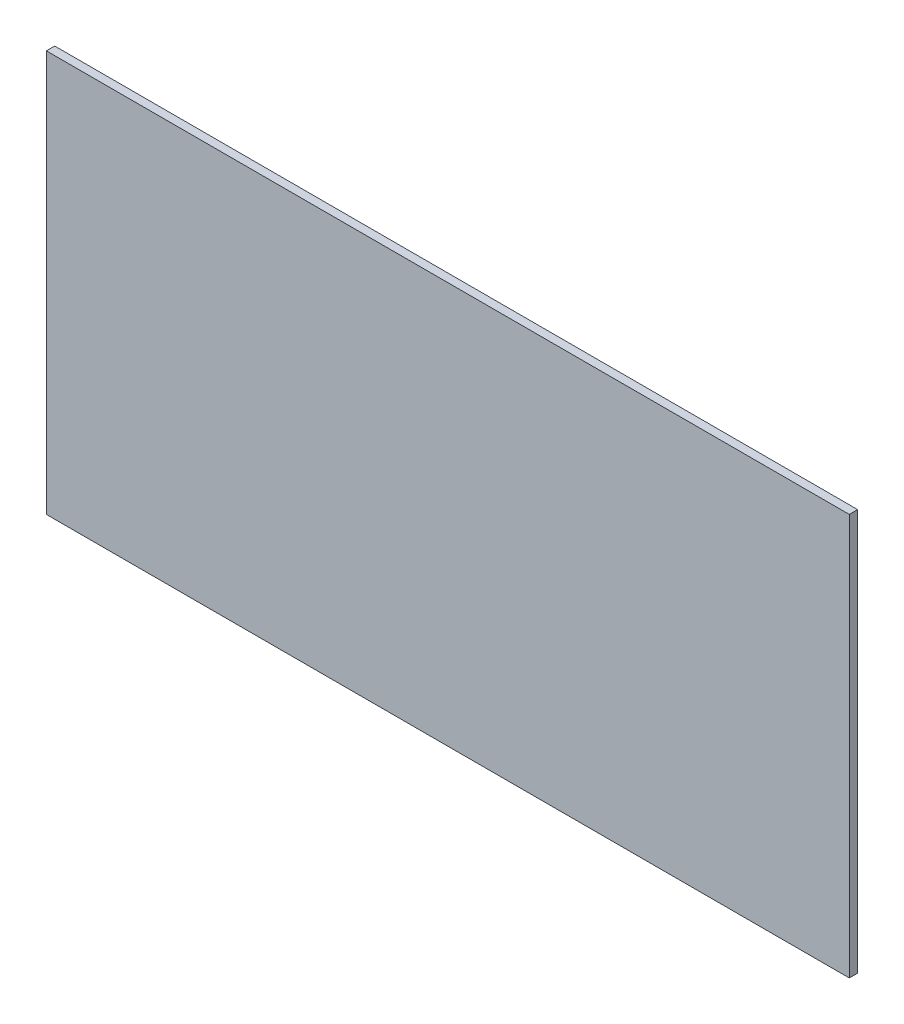
ISO-10303-21;
HEADER;
FILE_DESCRIPTION(('STEP AP214'),'2;1');
FILE_NAME('part.step','',(''),(''),'','','');
FILE_SCHEMA(('AUTOMOTIVE_DESIGN { 1 0 10303 214 1 1 1 1 }'));
ENDSEC;
DATA;
#1=APPLICATION_CONTEXT('core data for automotive mechanical design processes');
#2=APPLICATION_PROTOCOL_DEFINITION('international standard','automotive_design',2000,#1);
#3=PRODUCT_CONTEXT('',#1,'mechanical');
#4=PRODUCT('Part','Part','',(#3));
#5=PRODUCT_RELATED_PRODUCT_CATEGORY('part','',(#4));
#6=PRODUCT_DEFINITION_FORMATION('','',#4);
#7=PRODUCT_DEFINITION_CONTEXT('part definition',#1,'design');
#8=PRODUCT_DEFINITION('design','',#6,#7);
#9=PRODUCT_DEFINITION_SHAPE('','',#8);
#10=(LENGTH_UNIT() NAMED_UNIT(*) SI_UNIT(.MILLI.,.METRE.));
#11=(NAMED_UNIT(*) PLANE_ANGLE_UNIT() SI_UNIT($,.RADIAN.));
#12=(NAMED_UNIT(*) SI_UNIT($,.STERADIAN.) SOLID_ANGLE_UNIT());
#13=UNCERTAINTY_MEASURE_WITH_UNIT(LENGTH_MEASURE(1.E-05),#10,'distance_accuracy_value','');
#14=(GEOMETRIC_REPRESENTATION_CONTEXT(3) GLOBAL_UNCERTAINTY_ASSIGNED_CONTEXT((#13)) GLOBAL_UNIT_ASSIGNED_CONTEXT((#10,
#11,#12)) REPRESENTATION_CONTEXT('',''));
#15=CARTESIAN_POINT('',(0.,0.,0.));
#16=DIRECTION('',(0.,0.,1.));
#17=DIRECTION('',(1.,0.,0.));
#18=AXIS2_PLACEMENT_3D('',#15,#16,#17);
#19=CARTESIAN_POINT('',(0.,0.,19.05));
#20=DIRECTION('',(1.,0.,0.));
#21=DIRECTION('',(0.,1.,0.));
#22=AXIS2_PLACEMENT_3D('',#19,#20,#21);
#23=PLANE('',#22);
#24=DIRECTION('',(0.,-1.,0.));
#25=VECTOR('',#24,1.);
#26=CARTESIAN_POINT('',(0.,0.,0.));
#27=LINE('',#26,#25);
#28=CARTESIAN_POINT('',(0.,0.,0.));
#29=VERTEX_POINT('',#28);
#30=CARTESIAN_POINT('',(1.11981703314034E-13,-914.4,0.));
#31=VERTEX_POINT('',#30);
#32=EDGE_CURVE('E96',#29,#31,#27,.T.);
#33=ORIENTED_EDGE('',*,*,#32,.T.);
#34=DIRECTION('',(0.,0.,-1.));
#35=VECTOR('',#34,1.);
#36=CARTESIAN_POINT('',(1.11981703314034E-13,-914.4,19.05));
#37=LINE('',#36,#35);
#38=CARTESIAN_POINT('',(1.11981703314034E-13,-914.4,19.05));
#39=VERTEX_POINT('',#38);
#40=EDGE_CURVE('E11',#39,#31,#37,.T.);
#41=ORIENTED_EDGE('',*,*,#40,.F.);
#42=DIRECTION('',(0.,-1.,0.));
#43=VECTOR('',#42,1.);
#44=CARTESIAN_POINT('',(0.,0.,19.05));
#45=LINE('',#44,#43);
#46=CARTESIAN_POINT('',(0.,0.,19.05));
#47=VERTEX_POINT('',#46);
#48=EDGE_CURVE('E84',#47,#39,#45,.T.);
#49=ORIENTED_EDGE('',*,*,#48,.F.);
#50=DIRECTION('',(0.,0.,-1.));
#51=VECTOR('',#50,1.);
#52=CARTESIAN_POINT('',(0.,0.,19.05));
#53=LINE('',#52,#51);
#54=EDGE_CURVE('E92',#47,#29,#53,.T.);
#55=ORIENTED_EDGE('',*,*,#54,.T.);
#56=EDGE_LOOP('',(#33,#41,#49,#55));
#57=FACE_BOUND('',#56,.T.);
#58=ADVANCED_FACE('F33',(#57),#23,.F.);
#59=CARTESIAN_POINT('',(1.11981703314034E-13,-914.4,19.05));
#60=DIRECTION('',(0.,1.,0.));
#61=DIRECTION('',(0.,0.,1.));
#62=AXIS2_PLACEMENT_3D('',#59,#60,#61);
#63=PLANE('',#62);
#64=DIRECTION('',(1.,0.,0.));
#65=VECTOR('',#64,1.);
#66=CARTESIAN_POINT('',(1.11981703314034E-13,-914.4,0.));
#67=LINE('',#66,#65);
#68=CARTESIAN_POINT('',(1828.8,-914.4,0.));
#69=VERTEX_POINT('',#68);
#70=EDGE_CURVE('E88',#31,#69,#67,.T.);
#71=ORIENTED_EDGE('',*,*,#70,.T.);
#72=DIRECTION('',(0.,0.,-1.));
#73=VECTOR('',#72,1.);
#74=CARTESIAN_POINT('',(1828.8,-914.4,19.05));
#75=LINE('',#74,#73);
#76=CARTESIAN_POINT('',(1828.8,-914.4,19.05));
#77=VERTEX_POINT('',#76);
#78=EDGE_CURVE('E41',#77,#69,#75,.T.);
#79=ORIENTED_EDGE('',*,*,#78,.F.);
#80=DIRECTION('',(1.,0.,0.));
#81=VECTOR('',#80,1.);
#82=CARTESIAN_POINT('',(1.11981703314034E-13,-914.4,19.05));
#83=LINE('',#82,#81);
#84=EDGE_CURVE('E79',#39,#77,#83,.T.);
#85=ORIENTED_EDGE('',*,*,#84,.F.);
#86=ORIENTED_EDGE('',*,*,#40,.T.);
#87=EDGE_LOOP('',(#71,#79,#85,#86));
#88=FACE_BOUND('',#87,.T.);
#89=ADVANCED_FACE('F87',(#88),#63,.F.);
#90=CARTESIAN_POINT('',(1828.8,0.,19.05));
#91=DIRECTION('',(-1.,0.,0.));
#92=DIRECTION('',(0.,-1.,0.));
#93=AXIS2_PLACEMENT_3D('',#90,#91,#92);
#94=PLANE('',#93);
#95=DIRECTION('',(0.,1.,0.));
#96=VECTOR('',#95,1.);
#97=CARTESIAN_POINT('',(1828.8,0.,0.));
#98=LINE('',#97,#96);
#99=CARTESIAN_POINT('',(1828.8,0.,0.));
#100=VERTEX_POINT('',#99);
#101=EDGE_CURVE('E66',#69,#100,#98,.T.);
#102=ORIENTED_EDGE('',*,*,#101,.T.);
#103=DIRECTION('',(0.,0.,-1.));
#104=VECTOR('',#103,1.);
#105=CARTESIAN_POINT('',(1828.8,0.,19.05));
#106=LINE('',#105,#104);
#107=CARTESIAN_POINT('',(1828.8,0.,19.05));
#108=VERTEX_POINT('',#107);
#109=EDGE_CURVE('E89',#108,#100,#106,.T.);
#110=ORIENTED_EDGE('',*,*,#109,.F.);
#111=DIRECTION('',(0.,1.,0.));
#112=VECTOR('',#111,1.);
#113=CARTESIAN_POINT('',(1828.8,0.,19.05));
#114=LINE('',#113,#112);
#115=EDGE_CURVE('E82',#77,#108,#114,.T.);
#116=ORIENTED_EDGE('',*,*,#115,.F.);
#117=ORIENTED_EDGE('',*,*,#78,.T.);
#118=EDGE_LOOP('',(#102,#110,#116,#117));
#119=FACE_BOUND('',#118,.T.);
#120=ADVANCED_FACE('F90',(#119),#94,.F.);
#121=CARTESIAN_POINT('',(0.,0.,19.05));
#122=DIRECTION('',(0.,-1.,0.));
#123=DIRECTION('',(0.,0.,-1.));
#124=AXIS2_PLACEMENT_3D('',#121,#122,#123);
#125=PLANE('',#124);
#126=DIRECTION('',(-1.,0.,0.));
#127=VECTOR('',#126,1.);
#128=CARTESIAN_POINT('',(0.,0.,0.));
#129=LINE('',#128,#127);
#130=EDGE_CURVE('E72',#100,#29,#129,.T.);
#131=ORIENTED_EDGE('',*,*,#130,.T.);
#132=ORIENTED_EDGE('',*,*,#54,.F.);
#133=DIRECTION('',(-1.,0.,0.));
#134=VECTOR('',#133,1.);
#135=CARTESIAN_POINT('',(0.,0.,19.05));
#136=LINE('',#135,#134);
#137=EDGE_CURVE('E49',#108,#47,#136,.T.);
#138=ORIENTED_EDGE('',*,*,#137,.F.);
#139=ORIENTED_EDGE('',*,*,#109,.T.);
#140=EDGE_LOOP('',(#131,#132,#138,#139));
#141=FACE_BOUND('',#140,.T.);
#142=ADVANCED_FACE('F103',(#141),#125,.F.);
#143=CARTESIAN_POINT('',(0.,0.,19.05));
#144=DIRECTION('',(0.,0.,1.));
#145=DIRECTION('',(1.,0.,0.));
#146=AXIS2_PLACEMENT_3D('',#143,#144,#145);
#147=PLANE('',#146);
#148=ORIENTED_EDGE('',*,*,#48,.T.);
#149=ORIENTED_EDGE('',*,*,#84,.T.);
#150=ORIENTED_EDGE('',*,*,#115,.T.);
#151=ORIENTED_EDGE('',*,*,#137,.T.);
#152=EDGE_LOOP('',(#148,#149,#150,#151));
#153=FACE_BOUND('',#152,.T.);
#154=ADVANCED_FACE('F80',(#153),#147,.T.);
#155=CARTESIAN_POINT('',(0.,0.,0.));
#156=DIRECTION('',(0.,0.,1.));
#157=DIRECTION('',(1.,0.,0.));
#158=AXIS2_PLACEMENT_3D('',#155,#156,#157);
#159=PLANE('',#158);
#160=ORIENTED_EDGE('',*,*,#32,.F.);
#161=ORIENTED_EDGE('',*,*,#130,.F.);
#162=ORIENTED_EDGE('',*,*,#101,.F.);
#163=ORIENTED_EDGE('',*,*,#70,.F.);
#164=EDGE_LOOP('',(#160,#161,#162,#163));
#165=FACE_BOUND('',#164,.T.);
#166=ADVANCED_FACE('F106',(#165),#159,.F.);
#167=CLOSED_SHELL('',(#58,#89,#120,#142,#154,#166));
#168=MANIFOLD_SOLID_BREP('B2',#167);
#169=ADVANCED_BREP_SHAPE_REPRESENTATION('',(#18,#168),#14);
#170=SHAPE_DEFINITION_REPRESENTATION(#9,#169);
ENDSEC;
END-ISO-10303-21;
